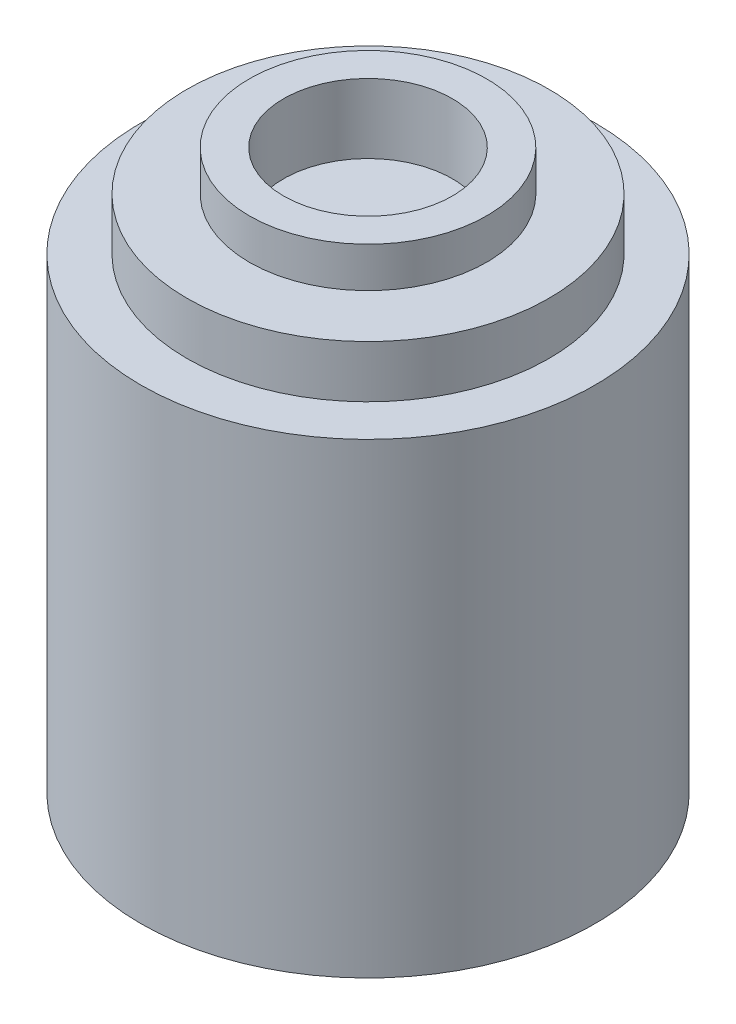
ISO-10303-21;
HEADER;
FILE_DESCRIPTION(('STEP AP214'),'2;1');
FILE_NAME('part.step','',(''),(''),'','','');
FILE_SCHEMA(('AUTOMOTIVE_DESIGN { 1 0 10303 214 1 1 1 1 }'));
ENDSEC;
DATA;
#1=APPLICATION_CONTEXT('core data for automotive mechanical design processes');
#2=APPLICATION_PROTOCOL_DEFINITION('international standard','automotive_design',2000,#1);
#3=PRODUCT_CONTEXT('',#1,'mechanical');
#4=PRODUCT('Part','Part','',(#3));
#5=PRODUCT_RELATED_PRODUCT_CATEGORY('part','',(#4));
#6=PRODUCT_DEFINITION_FORMATION('','',#4);
#7=PRODUCT_DEFINITION_CONTEXT('part definition',#1,'design');
#8=PRODUCT_DEFINITION('design','',#6,#7);
#9=PRODUCT_DEFINITION_SHAPE('','',#8);
#10=(LENGTH_UNIT() NAMED_UNIT(*) SI_UNIT(.MILLI.,.METRE.));
#11=(NAMED_UNIT(*) PLANE_ANGLE_UNIT() SI_UNIT($,.RADIAN.));
#12=(NAMED_UNIT(*) SI_UNIT($,.STERADIAN.) SOLID_ANGLE_UNIT());
#13=UNCERTAINTY_MEASURE_WITH_UNIT(LENGTH_MEASURE(1.E-05),#10,'distance_accuracy_value','');
#14=(GEOMETRIC_REPRESENTATION_CONTEXT(3) GLOBAL_UNCERTAINTY_ASSIGNED_CONTEXT((#13)) GLOBAL_UNIT_ASSIGNED_CONTEXT((#10,
#11,#12)) REPRESENTATION_CONTEXT('',''));
#15=CARTESIAN_POINT('',(0.,0.,0.));
#16=DIRECTION('',(0.,0.,1.));
#17=DIRECTION('',(1.,0.,0.));
#18=AXIS2_PLACEMENT_3D('',#15,#16,#17);
#19=CARTESIAN_POINT('',(0.,-91.05,0.));
#20=DIRECTION('',(0.,1.,0.));
#21=DIRECTION('',(0.,0.,1.));
#22=AXIS2_PLACEMENT_3D('',#19,#20,#21);
#23=CYLINDRICAL_SURFACE('',#22,37.);
#24=CARTESIAN_POINT('',(0.,-91.05,0.));
#25=DIRECTION('',(0.,1.,0.));
#26=DIRECTION('',(0.,0.,1.));
#27=AXIS2_PLACEMENT_3D('',#24,#25,#26);
#28=CIRCLE('',#27,37.);
#29=CARTESIAN_POINT('',(0.,-91.05,37.));
#30=VERTEX_POINT('',#29);
#31=EDGE_CURVE('E10',#30,#30,#28,.T.);
#32=ORIENTED_EDGE('',*,*,#31,.T.);
#33=EDGE_LOOP('',(#32));
#34=FACE_BOUND('',#33,.T.);
#35=CARTESIAN_POINT('',(0.,-15.05,0.));
#36=DIRECTION('',(0.,1.,0.));
#37=DIRECTION('',(0.,0.,1.));
#38=AXIS2_PLACEMENT_3D('',#35,#36,#37);
#39=CIRCLE('',#38,37.);
#40=CARTESIAN_POINT('',(0.,-15.05,37.));
#41=VERTEX_POINT('',#40);
#42=EDGE_CURVE('E48',#41,#41,#39,.T.);
#43=ORIENTED_EDGE('',*,*,#42,.F.);
#44=EDGE_LOOP('',(#43));
#45=FACE_BOUND('',#44,.T.);
#46=ADVANCED_FACE('F45',(#34,#45),#23,.T.);
#47=CARTESIAN_POINT('',(0.,-91.05,0.));
#48=DIRECTION('',(0.,1.,0.));
#49=DIRECTION('',(0.,0.,1.));
#50=AXIS2_PLACEMENT_3D('',#47,#48,#49);
#51=PLANE('',#50);
#52=CARTESIAN_POINT('',(0.,-91.05,0.));
#53=DIRECTION('',(0.,-1.,0.));
#54=DIRECTION('',(0.,0.,-1.));
#55=AXIS2_PLACEMENT_3D('',#52,#53,#54);
#56=CIRCLE('',#55,35.5);
#57=CARTESIAN_POINT('',(0.,-91.05,-35.5));
#58=VERTEX_POINT('',#57);
#59=EDGE_CURVE('E75',#58,#58,#56,.T.);
#60=ORIENTED_EDGE('',*,*,#59,.F.);
#61=EDGE_LOOP('',(#60));
#62=FACE_BOUND('',#61,.T.);
#63=ORIENTED_EDGE('',*,*,#31,.F.);
#64=EDGE_LOOP('',(#63));
#65=FACE_BOUND('',#64,.T.);
#66=ADVANCED_FACE('F103',(#62,#65),#51,.F.);
#67=CARTESIAN_POINT('',(0.,-15.05,0.));
#68=DIRECTION('',(0.,1.,0.));
#69=DIRECTION('',(0.,0.,1.));
#70=AXIS2_PLACEMENT_3D('',#67,#68,#69);
#71=PLANE('',#70);
#72=CARTESIAN_POINT('',(0.,-15.05,0.));
#73=DIRECTION('',(0.,1.,0.));
#74=DIRECTION('',(0.,0.,1.));
#75=AXIS2_PLACEMENT_3D('',#72,#73,#74);
#76=CIRCLE('',#75,29.5);
#77=CARTESIAN_POINT('',(0.,-15.05,29.5));
#78=VERTEX_POINT('',#77);
#79=EDGE_CURVE('E55',#78,#78,#76,.F.);
#80=ORIENTED_EDGE('',*,*,#79,.T.);
#81=EDGE_LOOP('',(#80));
#82=FACE_BOUND('',#81,.T.);
#83=ORIENTED_EDGE('',*,*,#42,.T.);
#84=EDGE_LOOP('',(#83));
#85=FACE_BOUND('',#84,.T.);
#86=ADVANCED_FACE('F106',(#82,#85),#71,.T.);
#87=CARTESIAN_POINT('',(0.,-6.55,0.));
#88=DIRECTION('',(0.,1.,0.));
#89=DIRECTION('',(0.,0.,1.));
#90=AXIS2_PLACEMENT_3D('',#87,#88,#89);
#91=PLANE('',#90);
#92=CARTESIAN_POINT('',(0.,-6.55,0.));
#93=DIRECTION('',(0.,1.,0.));
#94=DIRECTION('',(0.,0.,1.));
#95=AXIS2_PLACEMENT_3D('',#92,#93,#94);
#96=CIRCLE('',#95,19.34);
#97=CARTESIAN_POINT('',(0.,-6.55,19.34));
#98=VERTEX_POINT('',#97);
#99=EDGE_CURVE('E62',#98,#98,#96,.F.);
#100=ORIENTED_EDGE('',*,*,#99,.T.);
#101=EDGE_LOOP('',(#100));
#102=FACE_BOUND('',#101,.T.);
#103=CARTESIAN_POINT('',(0.,-6.55,0.));
#104=DIRECTION('',(0.,1.,0.));
#105=DIRECTION('',(0.,0.,1.));
#106=AXIS2_PLACEMENT_3D('',#103,#104,#105);
#107=CIRCLE('',#106,29.5);
#108=CARTESIAN_POINT('',(0.,-6.55,29.5));
#109=VERTEX_POINT('',#108);
#110=EDGE_CURVE('E59',#109,#109,#107,.T.);
#111=ORIENTED_EDGE('',*,*,#110,.T.);
#112=EDGE_LOOP('',(#111));
#113=FACE_BOUND('',#112,.T.);
#114=ADVANCED_FACE('F113',(#102,#113),#91,.T.);
#115=CARTESIAN_POINT('',(0.,-91.052,0.));
#116=DIRECTION('',(0.,1.,0.));
#117=DIRECTION('',(0.,0.,1.));
#118=AXIS2_PLACEMENT_3D('',#115,#116,#117);
#119=CYLINDRICAL_SURFACE('',#118,29.5);
#120=ORIENTED_EDGE('',*,*,#79,.F.);
#121=EDGE_LOOP('',(#120));
#122=FACE_BOUND('',#121,.T.);
#123=ORIENTED_EDGE('',*,*,#110,.F.);
#124=EDGE_LOOP('',(#123));
#125=FACE_BOUND('',#124,.T.);
#126=ADVANCED_FACE('F115',(#122,#125),#119,.T.);
#127=CARTESIAN_POINT('',(0.,0.,0.));
#128=DIRECTION('',(0.,1.,0.));
#129=DIRECTION('',(0.,0.,1.));
#130=AXIS2_PLACEMENT_3D('',#127,#128,#129);
#131=PLANE('',#130);
#132=CARTESIAN_POINT('',(0.,0.,0.));
#133=DIRECTION('',(0.,1.,0.));
#134=DIRECTION('',(0.,0.,1.));
#135=AXIS2_PLACEMENT_3D('',#132,#133,#134);
#136=CIRCLE('',#135,13.75);
#137=CARTESIAN_POINT('',(0.,0.,13.75));
#138=VERTEX_POINT('',#137);
#139=EDGE_CURVE('E68',#138,#138,#136,.T.);
#140=ORIENTED_EDGE('',*,*,#139,.F.);
#141=EDGE_LOOP('',(#140));
#142=FACE_BOUND('',#141,.T.);
#143=CARTESIAN_POINT('',(0.,0.,0.));
#144=DIRECTION('',(0.,1.,0.));
#145=DIRECTION('',(0.,0.,1.));
#146=AXIS2_PLACEMENT_3D('',#143,#144,#145);
#147=CIRCLE('',#146,19.34);
#148=CARTESIAN_POINT('',(0.,0.,19.34));
#149=VERTEX_POINT('',#148);
#150=EDGE_CURVE('E65',#149,#149,#147,.T.);
#151=ORIENTED_EDGE('',*,*,#150,.T.);
#152=EDGE_LOOP('',(#151));
#153=FACE_BOUND('',#152,.T.);
#154=ADVANCED_FACE('F136',(#142,#153),#131,.T.);
#155=CARTESIAN_POINT('',(0.,-91.052,0.));
#156=DIRECTION('',(0.,1.,0.));
#157=DIRECTION('',(0.,0.,1.));
#158=AXIS2_PLACEMENT_3D('',#155,#156,#157);
#159=CYLINDRICAL_SURFACE('',#158,19.34);
#160=ORIENTED_EDGE('',*,*,#99,.F.);
#161=EDGE_LOOP('',(#160));
#162=FACE_BOUND('',#161,.T.);
#163=ORIENTED_EDGE('',*,*,#150,.F.);
#164=EDGE_LOOP('',(#163));
#165=FACE_BOUND('',#164,.T.);
#166=ADVANCED_FACE('F134',(#162,#165),#159,.T.);
#167=CARTESIAN_POINT('',(0.,38.8908729652601,0.));
#168=DIRECTION('',(0.,-1.,0.));
#169=DIRECTION('',(0.,0.,-1.));
#170=AXIS2_PLACEMENT_3D('',#167,#168,#169);
#171=CYLINDRICAL_SURFACE('',#170,13.75);
#172=CARTESIAN_POINT('',(0.,-11.3,0.));
#173=DIRECTION('',(0.,1.,0.));
#174=DIRECTION('',(0.,0.,1.));
#175=AXIS2_PLACEMENT_3D('',#172,#173,#174);
#176=CIRCLE('',#175,13.75);
#177=CARTESIAN_POINT('',(0.,-11.3,13.75));
#178=VERTEX_POINT('',#177);
#179=EDGE_CURVE('E71',#178,#178,#176,.T.);
#180=ORIENTED_EDGE('',*,*,#179,.F.);
#181=EDGE_LOOP('',(#180));
#182=FACE_BOUND('',#181,.T.);
#183=ORIENTED_EDGE('',*,*,#139,.T.);
#184=EDGE_LOOP('',(#183));
#185=FACE_BOUND('',#184,.T.);
#186=ADVANCED_FACE('F130',(#182,#185),#171,.F.);
#187=CARTESIAN_POINT('',(0.,-11.3,0.));
#188=DIRECTION('',(0.,1.,0.));
#189=DIRECTION('',(0.,0.,1.));
#190=AXIS2_PLACEMENT_3D('',#187,#188,#189);
#191=PLANE('',#190);
#192=ORIENTED_EDGE('',*,*,#179,.T.);
#193=EDGE_LOOP('',(#192));
#194=FACE_BOUND('',#193,.T.);
#195=ADVANCED_FACE('F99',(#194),#191,.T.);
#196=CARTESIAN_POINT('',(0.,-82.05,0.));
#197=DIRECTION('',(0.,-1.,0.));
#198=DIRECTION('',(0.,0.,-1.));
#199=AXIS2_PLACEMENT_3D('',#196,#197,#198);
#200=CYLINDRICAL_SURFACE('',#199,35.5);
#201=CARTESIAN_POINT('',(0.,-82.05,0.));
#202=DIRECTION('',(0.,-1.,0.));
#203=DIRECTION('',(0.,0.,-1.));
#204=AXIS2_PLACEMENT_3D('',#201,#202,#203);
#205=CIRCLE('',#204,35.5);
#206=CARTESIAN_POINT('',(0.,-82.05,-35.5));
#207=VERTEX_POINT('',#206);
#208=EDGE_CURVE('E74',#207,#207,#205,.T.);
#209=ORIENTED_EDGE('',*,*,#208,.F.);
#210=EDGE_LOOP('',(#209));
#211=FACE_BOUND('',#210,.T.);
#212=ORIENTED_EDGE('',*,*,#59,.T.);
#213=EDGE_LOOP('',(#212));
#214=FACE_BOUND('',#213,.T.);
#215=ADVANCED_FACE('F93',(#211,#214),#200,.F.);
#216=CARTESIAN_POINT('',(0.,-82.05,0.));
#217=DIRECTION('',(0.,-1.,0.));
#218=DIRECTION('',(0.,0.,-1.));
#219=AXIS2_PLACEMENT_3D('',#216,#217,#218);
#220=PLANE('',#219);
#221=CARTESIAN_POINT('',(0.,-82.05,0.));
#222=DIRECTION('',(0.,-1.,0.));
#223=DIRECTION('',(0.,0.,-1.));
#224=AXIS2_PLACEMENT_3D('',#221,#222,#223);
#225=CIRCLE('',#224,17.);
#226=CARTESIAN_POINT('',(0.,-82.05,-17.));
#227=VERTEX_POINT('',#226);
#228=EDGE_CURVE('E78',#227,#227,#225,.T.);
#229=ORIENTED_EDGE('',*,*,#228,.F.);
#230=EDGE_LOOP('',(#229));
#231=FACE_BOUND('',#230,.T.);
#232=ORIENTED_EDGE('',*,*,#208,.T.);
#233=EDGE_LOOP('',(#232));
#234=FACE_BOUND('',#233,.T.);
#235=ADVANCED_FACE('F90',(#231,#234),#220,.T.);
#236=CARTESIAN_POINT('',(0.,-82.05,0.));
#237=DIRECTION('',(0.,-1.,0.));
#238=DIRECTION('',(0.,0.,-1.));
#239=AXIS2_PLACEMENT_3D('',#236,#237,#238);
#240=CYLINDRICAL_SURFACE('',#239,17.);
#241=ORIENTED_EDGE('',*,*,#228,.T.);
#242=EDGE_LOOP('',(#241));
#243=FACE_BOUND('',#242,.T.);
#244=CARTESIAN_POINT('',(0.,-91.05,0.));
#245=DIRECTION('',(0.,-1.,0.));
#246=DIRECTION('',(0.,0.,-1.));
#247=AXIS2_PLACEMENT_3D('',#244,#245,#246);
#248=CIRCLE('',#247,17.);
#249=CARTESIAN_POINT('',(0.,-91.05,-17.));
#250=VERTEX_POINT('',#249);
#251=EDGE_CURVE('E81',#250,#250,#248,.T.);
#252=ORIENTED_EDGE('',*,*,#251,.F.);
#253=EDGE_LOOP('',(#252));
#254=FACE_BOUND('',#253,.T.);
#255=ADVANCED_FACE('F87',(#243,#254),#240,.T.);
#256=ORIENTED_EDGE('',*,*,#251,.T.);
#257=EDGE_LOOP('',(#256));
#258=FACE_BOUND('',#257,.T.);
#259=ADVANCED_FACE('F108',(#258),#51,.F.);
#260=CLOSED_SHELL('',(#46,#66,#86,#114,#126,#154,#166,#186,#195,#215,#235,#255,#259));
#261=MANIFOLD_SOLID_BREP('B2',#260);
#262=ADVANCED_BREP_SHAPE_REPRESENTATION('',(#18,#261),#14);
#263=SHAPE_DEFINITION_REPRESENTATION(#9,#262);
ENDSEC;
END-ISO-10303-21;
